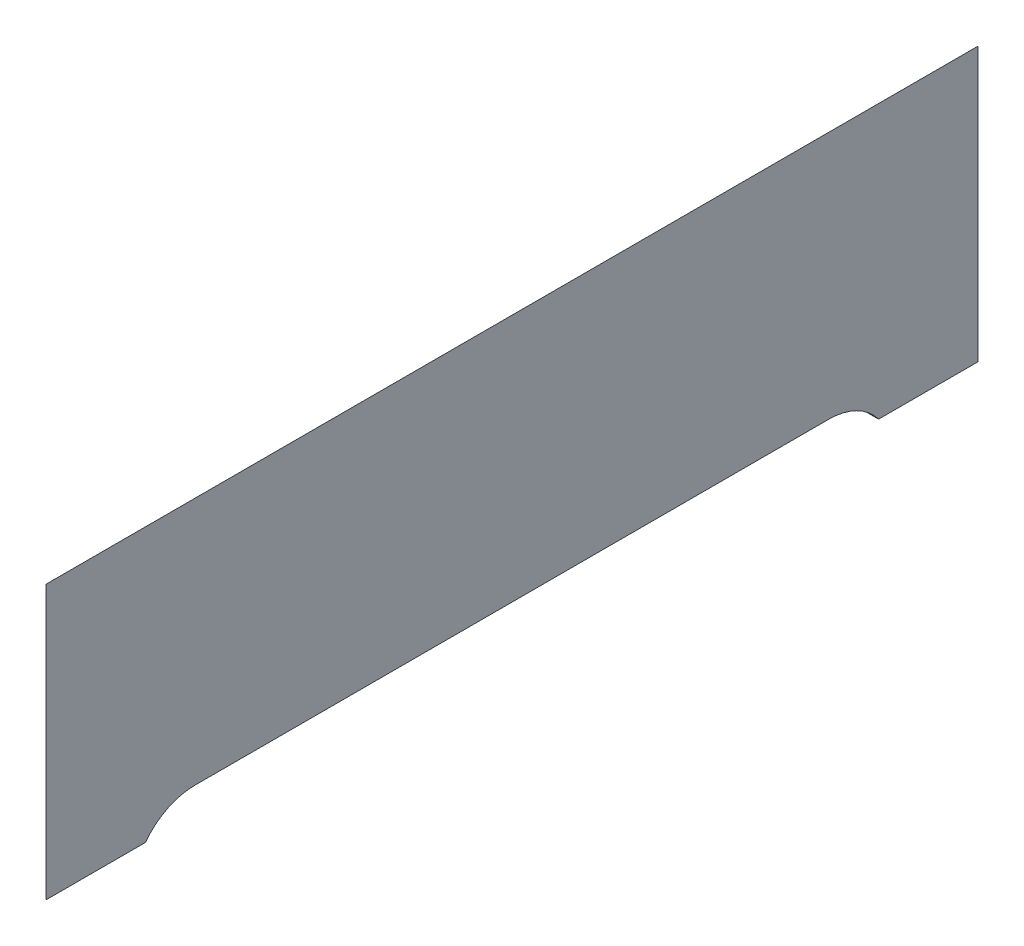
ISO-10303-21;
HEADER;
FILE_DESCRIPTION(('STEP AP214'),'2;1');
FILE_NAME('part.step','',(''),(''),'','','');
FILE_SCHEMA(('AUTOMOTIVE_DESIGN { 1 0 10303 214 1 1 1 1 }'));
ENDSEC;
DATA;
#1=APPLICATION_CONTEXT('core data for automotive mechanical design processes');
#2=APPLICATION_PROTOCOL_DEFINITION('international standard','automotive_design',2000,#1);
#3=PRODUCT_CONTEXT('',#1,'mechanical');
#4=PRODUCT('Part','Part','',(#3));
#5=PRODUCT_RELATED_PRODUCT_CATEGORY('part','',(#4));
#6=PRODUCT_DEFINITION_FORMATION('','',#4);
#7=PRODUCT_DEFINITION_CONTEXT('part definition',#1,'design');
#8=PRODUCT_DEFINITION('design','',#6,#7);
#9=PRODUCT_DEFINITION_SHAPE('','',#8);
#10=(LENGTH_UNIT() NAMED_UNIT(*) SI_UNIT(.MILLI.,.METRE.));
#11=(NAMED_UNIT(*) PLANE_ANGLE_UNIT() SI_UNIT($,.RADIAN.));
#12=(NAMED_UNIT(*) SI_UNIT($,.STERADIAN.) SOLID_ANGLE_UNIT());
#13=UNCERTAINTY_MEASURE_WITH_UNIT(LENGTH_MEASURE(1.E-05),#10,'distance_accuracy_value','');
#14=(GEOMETRIC_REPRESENTATION_CONTEXT(3) GLOBAL_UNCERTAINTY_ASSIGNED_CONTEXT((#13)) GLOBAL_UNIT_ASSIGNED_CONTEXT((#10,
#11,#12)) REPRESENTATION_CONTEXT('',''));
#15=CARTESIAN_POINT('',(0.,0.,0.));
#16=DIRECTION('',(0.,0.,1.));
#17=DIRECTION('',(1.,0.,0.));
#18=AXIS2_PLACEMENT_3D('',#15,#16,#17);
#19=CARTESIAN_POINT('',(12.,-10.,0.));
#20=DIRECTION('',(0.,1.,0.));
#21=DIRECTION('',(0.,0.,1.));
#22=AXIS2_PLACEMENT_3D('',#19,#20,#21);
#23=PLANE('',#22);
#24=DIRECTION('',(0.,0.,-1.));
#25=VECTOR('',#24,1.);
#26=CARTESIAN_POINT('',(12.,-10.,0.));
#27=LINE('',#26,#25);
#28=CARTESIAN_POINT('',(12.,-10.,0.));
#29=VERTEX_POINT('',#28);
#30=CARTESIAN_POINT('',(12.,-10.,-40.));
#31=VERTEX_POINT('',#30);
#32=EDGE_CURVE('E111',#29,#31,#27,.T.);
#33=ORIENTED_EDGE('',*,*,#32,.F.);
#34=DIRECTION('',(0.707106781186547,0.,0.707106781186548));
#35=VECTOR('',#34,1.);
#36=CARTESIAN_POINT('',(12.,-10.,0.));
#37=LINE('',#36,#35);
#38=CARTESIAN_POINT('',(0.,-10.,-12.));
#39=VERTEX_POINT('',#38);
#40=EDGE_CURVE('E11',#29,#39,#37,.F.);
#41=ORIENTED_EDGE('',*,*,#40,.T.);
#42=DIRECTION('',(0.,0.,-1.));
#43=VECTOR('',#42,1.);
#44=CARTESIAN_POINT('',(0.,-10.,0.));
#45=LINE('',#44,#43);
#46=CARTESIAN_POINT('',(0.,-10.,-40.));
#47=VERTEX_POINT('',#46);
#48=EDGE_CURVE('E145',#39,#47,#45,.T.);
#49=ORIENTED_EDGE('',*,*,#48,.T.);
#50=DIRECTION('',(-1.,0.,0.));
#51=VECTOR('',#50,1.);
#52=CARTESIAN_POINT('',(12.,-10.,-40.));
#53=LINE('',#52,#51);
#54=EDGE_CURVE('E124',#31,#47,#53,.T.);
#55=ORIENTED_EDGE('',*,*,#54,.F.);
#56=EDGE_LOOP('',(#33,#41,#49,#55));
#57=FACE_BOUND('',#56,.T.);
#58=ADVANCED_FACE('F41',(#57),#23,.F.);
#59=CARTESIAN_POINT('',(12.,-25.,-60.));
#60=DIRECTION('',(-1.,0.,0.));
#61=DIRECTION('',(0.,0.,1.));
#62=AXIS2_PLACEMENT_3D('',#59,#60,#61);
#63=CYLINDRICAL_SURFACE('',#62,25.);
#64=CARTESIAN_POINT('',(0.,-25.,-60.));
#65=DIRECTION('',(-1.,0.,0.));
#66=DIRECTION('',(0.,0.,1.));
#67=AXIS2_PLACEMENT_3D('',#64,#65,#66);
#68=CIRCLE('',#67,25.);
#69=CARTESIAN_POINT('',(0.,0.,-60.));
#70=VERTEX_POINT('',#69);
#71=EDGE_CURVE('E148',#47,#70,#68,.T.);
#72=ORIENTED_EDGE('',*,*,#71,.T.);
#73=DIRECTION('',(-1.,0.,0.));
#74=VECTOR('',#73,1.);
#75=CARTESIAN_POINT('',(12.,0.,-60.));
#76=LINE('',#75,#74);
#77=CARTESIAN_POINT('',(12.,0.,-60.));
#78=VERTEX_POINT('',#77);
#79=EDGE_CURVE('E172',#78,#70,#76,.T.);
#80=ORIENTED_EDGE('',*,*,#79,.F.);
#81=CARTESIAN_POINT('',(12.,-25.,-60.));
#82=DIRECTION('',(-1.,0.,0.));
#83=DIRECTION('',(0.,0.,1.));
#84=AXIS2_PLACEMENT_3D('',#81,#82,#83);
#85=CIRCLE('',#84,25.);
#86=EDGE_CURVE('E127',#31,#78,#85,.T.);
#87=ORIENTED_EDGE('',*,*,#86,.F.);
#88=ORIENTED_EDGE('',*,*,#54,.T.);
#89=EDGE_LOOP('',(#72,#80,#87,#88));
#90=FACE_BOUND('',#89,.T.);
#91=ADVANCED_FACE('F178',(#90),#63,.F.);
#92=CARTESIAN_POINT('',(12.,0.,-60.));
#93=DIRECTION('',(0.,1.,0.));
#94=DIRECTION('',(0.,0.,1.));
#95=AXIS2_PLACEMENT_3D('',#92,#93,#94);
#96=PLANE('',#95);
#97=DIRECTION('',(0.,0.,-1.));
#98=VECTOR('',#97,1.);
#99=CARTESIAN_POINT('',(0.,0.,-60.));
#100=LINE('',#99,#98);
#101=CARTESIAN_POINT('',(0.,0.,-315.));
#102=VERTEX_POINT('',#101);
#103=EDGE_CURVE('E151',#70,#102,#100,.T.);
#104=ORIENTED_EDGE('',*,*,#103,.T.);
#105=DIRECTION('',(-1.,0.,0.));
#106=VECTOR('',#105,1.);
#107=CARTESIAN_POINT('',(12.,0.,-315.));
#108=LINE('',#107,#106);
#109=CARTESIAN_POINT('',(12.,0.,-315.));
#110=VERTEX_POINT('',#109);
#111=EDGE_CURVE('E168',#110,#102,#108,.T.);
#112=ORIENTED_EDGE('',*,*,#111,.F.);
#113=DIRECTION('',(0.,0.,-1.));
#114=VECTOR('',#113,1.);
#115=CARTESIAN_POINT('',(12.,0.,-60.));
#116=LINE('',#115,#114);
#117=EDGE_CURVE('E197',#78,#110,#116,.T.);
#118=ORIENTED_EDGE('',*,*,#117,.F.);
#119=ORIENTED_EDGE('',*,*,#79,.T.);
#120=EDGE_LOOP('',(#104,#112,#118,#119));
#121=FACE_BOUND('',#120,.T.);
#122=ADVANCED_FACE('F186',(#121),#96,.F.);
#123=CARTESIAN_POINT('',(12.,-25.,-315.));
#124=DIRECTION('',(-1.,0.,0.));
#125=DIRECTION('',(0.,0.,1.));
#126=AXIS2_PLACEMENT_3D('',#123,#124,#125);
#127=CYLINDRICAL_SURFACE('',#126,25.);
#128=CARTESIAN_POINT('',(0.,-25.,-315.));
#129=DIRECTION('',(-1.,0.,0.));
#130=DIRECTION('',(0.,0.,-1.));
#131=AXIS2_PLACEMENT_3D('',#128,#129,#130);
#132=CIRCLE('',#131,25.);
#133=CARTESIAN_POINT('',(0.,-10.,-335.));
#134=VERTEX_POINT('',#133);
#135=EDGE_CURVE('E158',#102,#134,#132,.T.);
#136=ORIENTED_EDGE('',*,*,#135,.T.);
#137=DIRECTION('',(-1.,0.,0.));
#138=VECTOR('',#137,1.);
#139=CARTESIAN_POINT('',(12.,-10.,-335.));
#140=LINE('',#139,#138);
#141=CARTESIAN_POINT('',(12.,-10.,-335.));
#142=VERTEX_POINT('',#141);
#143=EDGE_CURVE('E164',#142,#134,#140,.T.);
#144=ORIENTED_EDGE('',*,*,#143,.F.);
#145=CARTESIAN_POINT('',(12.,-25.,-315.));
#146=DIRECTION('',(-1.,0.,0.));
#147=DIRECTION('',(0.,0.,-1.));
#148=AXIS2_PLACEMENT_3D('',#145,#146,#147);
#149=CIRCLE('',#148,25.);
#150=EDGE_CURVE('E192',#110,#142,#149,.T.);
#151=ORIENTED_EDGE('',*,*,#150,.F.);
#152=ORIENTED_EDGE('',*,*,#111,.T.);
#153=EDGE_LOOP('',(#136,#144,#151,#152));
#154=FACE_BOUND('',#153,.T.);
#155=ADVANCED_FACE('F190',(#154),#127,.F.);
#156=CARTESIAN_POINT('',(12.,-10.,-375.));
#157=DIRECTION('',(0.,1.,0.));
#158=DIRECTION('',(0.,0.,1.));
#159=AXIS2_PLACEMENT_3D('',#156,#157,#158);
#160=PLANE('',#159);
#161=DIRECTION('',(0.,0.,-1.));
#162=VECTOR('',#161,1.);
#163=CARTESIAN_POINT('',(0.,-10.,-375.));
#164=LINE('',#163,#162);
#165=CARTESIAN_POINT('',(0.,-10.,-363.));
#166=VERTEX_POINT('',#165);
#167=EDGE_CURVE('E120',#134,#166,#164,.T.);
#168=ORIENTED_EDGE('',*,*,#167,.T.);
#169=DIRECTION('',(-0.707106781186547,0.,0.707106781186548));
#170=VECTOR('',#169,1.);
#171=CARTESIAN_POINT('',(12.,-10.,-375.));
#172=LINE('',#171,#170);
#173=CARTESIAN_POINT('',(12.,-10.,-375.));
#174=VERTEX_POINT('',#173);
#175=EDGE_CURVE('E52',#166,#174,#172,.F.);
#176=ORIENTED_EDGE('',*,*,#175,.T.);
#177=DIRECTION('',(0.,0.,-1.));
#178=VECTOR('',#177,1.);
#179=CARTESIAN_POINT('',(12.,-10.,-375.));
#180=LINE('',#179,#178);
#181=EDGE_CURVE('E196',#142,#174,#180,.T.);
#182=ORIENTED_EDGE('',*,*,#181,.F.);
#183=ORIENTED_EDGE('',*,*,#143,.T.);
#184=EDGE_LOOP('',(#168,#176,#182,#183));
#185=FACE_BOUND('',#184,.T.);
#186=ADVANCED_FACE('F210',(#185),#160,.F.);
#187=CARTESIAN_POINT('',(12.,-25.,-315.));
#188=DIRECTION('',(1.,0.,0.));
#189=DIRECTION('',(0.,0.,-1.));
#190=AXIS2_PLACEMENT_3D('',#187,#188,#189);
#191=PLANE('',#190);
#192=DIRECTION('',(0.,-1.,0.));
#193=VECTOR('',#192,1.);
#194=CARTESIAN_POINT('',(12.,0.,0.));
#195=LINE('',#194,#193);
#196=CARTESIAN_POINT('',(12.,100.,0.));
#197=VERTEX_POINT('',#196);
#198=EDGE_CURVE('E108',#197,#29,#195,.T.);
#199=ORIENTED_EDGE('',*,*,#198,.T.);
#200=ORIENTED_EDGE('',*,*,#32,.T.);
#201=ORIENTED_EDGE('',*,*,#86,.T.);
#202=ORIENTED_EDGE('',*,*,#117,.T.);
#203=ORIENTED_EDGE('',*,*,#150,.T.);
#204=ORIENTED_EDGE('',*,*,#181,.T.);
#205=DIRECTION('',(0.,1.,0.));
#206=VECTOR('',#205,1.);
#207=CARTESIAN_POINT('',(12.,0.,-375.));
#208=LINE('',#207,#206);
#209=CARTESIAN_POINT('',(12.,100.,-375.));
#210=VERTEX_POINT('',#209);
#211=EDGE_CURVE('E201',#174,#210,#208,.T.);
#212=ORIENTED_EDGE('',*,*,#211,.T.);
#213=DIRECTION('',(0.,0.,1.));
#214=VECTOR('',#213,1.);
#215=CARTESIAN_POINT('',(12.,100.,0.));
#216=LINE('',#215,#214);
#217=EDGE_CURVE('E115',#210,#197,#216,.T.);
#218=ORIENTED_EDGE('',*,*,#217,.T.);
#219=EDGE_LOOP('',(#199,#200,#201,#202,#203,#204,#212,#218));
#220=FACE_BOUND('',#219,.T.);
#221=ADVANCED_FACE('F110',(#220),#191,.T.);
#222=CARTESIAN_POINT('',(0.,-25.,-315.));
#223=DIRECTION('',(1.,0.,0.));
#224=DIRECTION('',(0.,0.,-1.));
#225=AXIS2_PLACEMENT_3D('',#222,#223,#224);
#226=PLANE('',#225);
#227=DIRECTION('',(0.,0.,-1.));
#228=VECTOR('',#227,1.);
#229=CARTESIAN_POINT('',(0.,88.,-315.));
#230=LINE('',#229,#228);
#231=CARTESIAN_POINT('',(0.,88.,-12.));
#232=VERTEX_POINT('',#231);
#233=CARTESIAN_POINT('',(0.,88.,-363.));
#234=VERTEX_POINT('',#233);
#235=EDGE_CURVE('E60',#232,#234,#230,.T.);
#236=ORIENTED_EDGE('',*,*,#235,.T.);
#237=DIRECTION('',(0.,-1.,0.));
#238=VECTOR('',#237,1.);
#239=CARTESIAN_POINT('',(0.,-25.,-363.));
#240=LINE('',#239,#238);
#241=EDGE_CURVE('E130',#234,#166,#240,.T.);
#242=ORIENTED_EDGE('',*,*,#241,.T.);
#243=ORIENTED_EDGE('',*,*,#167,.F.);
#244=ORIENTED_EDGE('',*,*,#135,.F.);
#245=ORIENTED_EDGE('',*,*,#103,.F.);
#246=ORIENTED_EDGE('',*,*,#71,.F.);
#247=ORIENTED_EDGE('',*,*,#48,.F.);
#248=DIRECTION('',(0.,1.,0.));
#249=VECTOR('',#248,1.);
#250=CARTESIAN_POINT('',(0.,-25.,-12.));
#251=LINE('',#250,#249);
#252=EDGE_CURVE('E65',#39,#232,#251,.T.);
#253=ORIENTED_EDGE('',*,*,#252,.T.);
#254=EDGE_LOOP('',(#236,#242,#243,#244,#245,#246,#247,#253));
#255=FACE_BOUND('',#254,.T.);
#256=ADVANCED_FACE('F181',(#255),#226,.F.);
#257=CARTESIAN_POINT('',(12.,0.,0.));
#258=DIRECTION('',(0.707106781186548,0.,-0.707106781186547));
#259=DIRECTION('',(0.,-1.,0.));
#260=AXIS2_PLACEMENT_3D('',#257,#258,#259);
#261=PLANE('',#260);
#262=ORIENTED_EDGE('',*,*,#40,.F.);
#263=ORIENTED_EDGE('',*,*,#198,.F.);
#264=DIRECTION('',(0.577350269189626,0.577350269189626,0.577350269189626));
#265=VECTOR('',#264,1.);
#266=CARTESIAN_POINT('',(12.,100.,0.));
#267=LINE('',#266,#265);
#268=EDGE_CURVE('E46',#232,#197,#267,.T.);
#269=ORIENTED_EDGE('',*,*,#268,.F.);
#270=ORIENTED_EDGE('',*,*,#252,.F.);
#271=EDGE_LOOP('',(#262,#263,#269,#270));
#272=FACE_BOUND('',#271,.T.);
#273=ADVANCED_FACE('F44',(#272),#261,.F.);
#274=CARTESIAN_POINT('',(12.,100.,0.));
#275=DIRECTION('',(0.707106781186548,-0.707106781186547,0.));
#276=DIRECTION('',(0.,0.,1.));
#277=AXIS2_PLACEMENT_3D('',#274,#275,#276);
#278=PLANE('',#277);
#279=ORIENTED_EDGE('',*,*,#268,.T.);
#280=ORIENTED_EDGE('',*,*,#217,.F.);
#281=DIRECTION('',(-0.577350269189625,-0.577350269189626,0.577350269189626));
#282=VECTOR('',#281,1.);
#283=CARTESIAN_POINT('',(-113.,-25.0000000000001,-250.));
#284=LINE('',#283,#282);
#285=EDGE_CURVE('E139',#234,#210,#284,.F.);
#286=ORIENTED_EDGE('',*,*,#285,.F.);
#287=ORIENTED_EDGE('',*,*,#235,.F.);
#288=EDGE_LOOP('',(#279,#280,#286,#287));
#289=FACE_BOUND('',#288,.T.);
#290=ADVANCED_FACE('F233',(#289),#278,.F.);
#291=CARTESIAN_POINT('',(12.,0.,-375.));
#292=DIRECTION('',(0.707106781186548,0.,0.707106781186547));
#293=DIRECTION('',(0.,1.,0.));
#294=AXIS2_PLACEMENT_3D('',#291,#292,#293);
#295=PLANE('',#294);
#296=ORIENTED_EDGE('',*,*,#175,.F.);
#297=ORIENTED_EDGE('',*,*,#241,.F.);
#298=ORIENTED_EDGE('',*,*,#285,.T.);
#299=ORIENTED_EDGE('',*,*,#211,.F.);
#300=EDGE_LOOP('',(#296,#297,#298,#299));
#301=FACE_BOUND('',#300,.T.);
#302=ADVANCED_FACE('F208',(#301),#295,.F.);
#303=CLOSED_SHELL('',(#58,#91,#122,#155,#186,#221,#256,#273,#290,#302));
#304=MANIFOLD_SOLID_BREP('B2',#303);
#305=ADVANCED_BREP_SHAPE_REPRESENTATION('',(#18,#304),#14);
#306=SHAPE_DEFINITION_REPRESENTATION(#9,#305);
ENDSEC;
END-ISO-10303-21;
